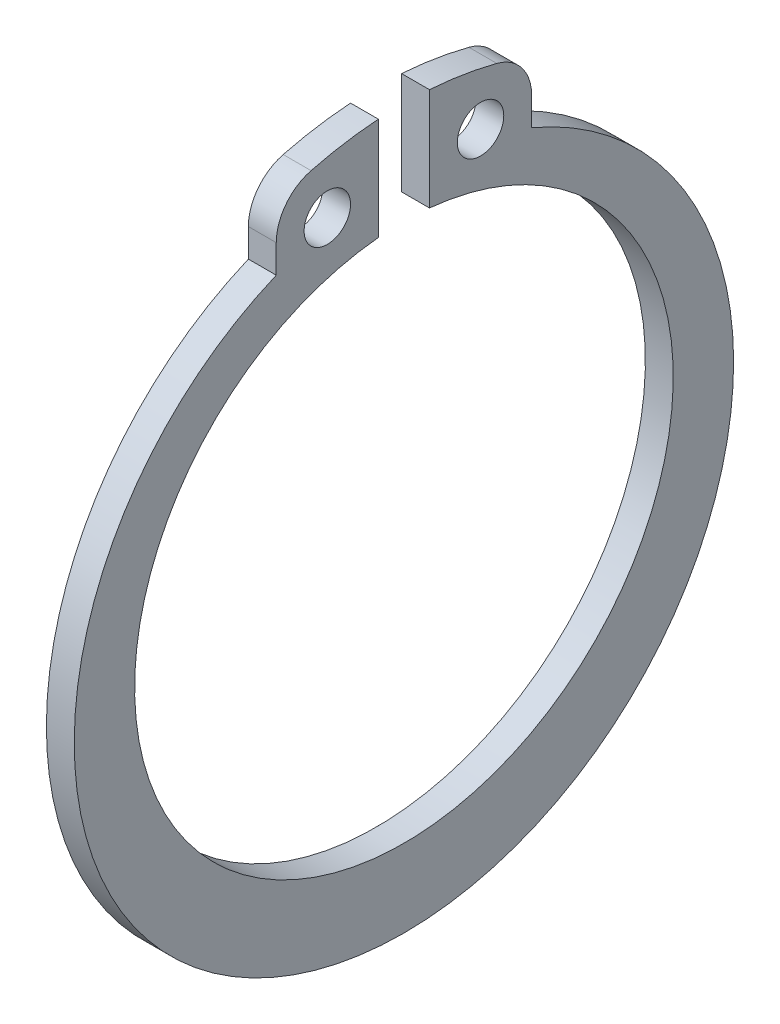
ISO-10303-21;
HEADER;
FILE_DESCRIPTION(('STEP AP214'),'2;1');
FILE_NAME('part.step','',(''),(''),'','','');
FILE_SCHEMA(('AUTOMOTIVE_DESIGN { 1 0 10303 214 1 1 1 1 }'));
ENDSEC;
DATA;
#1=APPLICATION_CONTEXT('core data for automotive mechanical design processes');
#2=APPLICATION_PROTOCOL_DEFINITION('international standard','automotive_design',2000,#1);
#3=PRODUCT_CONTEXT('',#1,'mechanical');
#4=PRODUCT('Part','Part','',(#3));
#5=PRODUCT_RELATED_PRODUCT_CATEGORY('part','',(#4));
#6=PRODUCT_DEFINITION_FORMATION('','',#4);
#7=PRODUCT_DEFINITION_CONTEXT('part definition',#1,'design');
#8=PRODUCT_DEFINITION('design','',#6,#7);
#9=PRODUCT_DEFINITION_SHAPE('','',#8);
#10=(LENGTH_UNIT() NAMED_UNIT(*) SI_UNIT(.MILLI.,.METRE.));
#11=(NAMED_UNIT(*) PLANE_ANGLE_UNIT() SI_UNIT($,.RADIAN.));
#12=(NAMED_UNIT(*) SI_UNIT($,.STERADIAN.) SOLID_ANGLE_UNIT());
#13=UNCERTAINTY_MEASURE_WITH_UNIT(LENGTH_MEASURE(1.E-05),#10,'distance_accuracy_value','');
#14=(GEOMETRIC_REPRESENTATION_CONTEXT(3) GLOBAL_UNCERTAINTY_ASSIGNED_CONTEXT((#13)) GLOBAL_UNIT_ASSIGNED_CONTEXT((#10,
#11,#12)) REPRESENTATION_CONTEXT('',''));
#15=CARTESIAN_POINT('',(0.,0.,0.));
#16=DIRECTION('',(0.,0.,1.));
#17=DIRECTION('',(1.,0.,0.));
#18=AXIS2_PLACEMENT_3D('',#15,#16,#17);
#19=CARTESIAN_POINT('',(0.99,8.34638827549408,2.275));
#20=DIRECTION('',(-1.,0.,0.));
#21=DIRECTION('',(0.,0.,1.));
#22=AXIS2_PLACEMENT_3D('',#19,#20,#21);
#23=CYLINDRICAL_SURFACE('',#22,1.3);
#24=CARTESIAN_POINT('',(0.21,8.34638827549408,2.275));
#25=DIRECTION('',(1.,0.,0.));
#26=DIRECTION('',(0.,0.,-1.));
#27=AXIS2_PLACEMENT_3D('',#24,#25,#26);
#28=CIRCLE('',#27,1.3);
#29=CARTESIAN_POINT('',(0.21,9.60510786301148,2.6));
#30=VERTEX_POINT('',#29);
#31=CARTESIAN_POINT('',(0.21,8.34638827549408,3.575));
#32=VERTEX_POINT('',#31);
#33=EDGE_CURVE('E11',#30,#32,#28,.T.);
#34=ORIENTED_EDGE('',*,*,#33,.T.);
#35=DIRECTION('',(-1.,0.,0.));
#36=VECTOR('',#35,1.);
#37=CARTESIAN_POINT('',(0.99,8.34638827549408,3.575));
#38=LINE('',#37,#36);
#39=CARTESIAN_POINT('',(0.99,8.34638827549408,3.575));
#40=VERTEX_POINT('',#39);
#41=EDGE_CURVE('E53',#40,#32,#38,.T.);
#42=ORIENTED_EDGE('',*,*,#41,.F.);
#43=CARTESIAN_POINT('',(0.99,8.34638827549408,2.275));
#44=DIRECTION('',(1.,0.,0.));
#45=DIRECTION('',(0.,0.,-1.));
#46=AXIS2_PLACEMENT_3D('',#43,#44,#45);
#47=CIRCLE('',#46,1.3);
#48=CARTESIAN_POINT('',(0.99,9.60510786301148,2.6));
#49=VERTEX_POINT('',#48);
#50=EDGE_CURVE('E164',#49,#40,#47,.T.);
#51=ORIENTED_EDGE('',*,*,#50,.F.);
#52=DIRECTION('',(-1.,0.,0.));
#53=VECTOR('',#52,1.);
#54=CARTESIAN_POINT('',(0.99,9.60510786301148,2.6));
#55=LINE('',#54,#53);
#56=EDGE_CURVE('E44',#49,#30,#55,.T.);
#57=ORIENTED_EDGE('',*,*,#56,.T.);
#58=EDGE_LOOP('',(#34,#42,#51,#57));
#59=FACE_BOUND('',#58,.T.);
#60=ADVANCED_FACE('F34',(#59),#23,.T.);
#61=CARTESIAN_POINT('',(0.99,-0.952148837127789,0.));
#62=DIRECTION('',(1.,0.,0.));
#63=DIRECTION('',(0.,0.,-1.));
#64=AXIS2_PLACEMENT_3D('',#61,#62,#63);
#65=PLANE('',#64);
#66=CARTESIAN_POINT('',(0.99,8.23777563582654,2.145));
#67=DIRECTION('',(1.,0.,0.));
#68=DIRECTION('',(0.,0.,-1.));
#69=AXIS2_PLACEMENT_3D('',#66,#67,#68);
#70=CIRCLE('',#69,0.65);
#71=CARTESIAN_POINT('',(0.99,8.23777563582654,1.495));
#72=VERTEX_POINT('',#71);
#73=EDGE_CURVE('E194',#72,#72,#70,.T.);
#74=ORIENTED_EDGE('',*,*,#73,.F.);
#75=EDGE_LOOP('',(#74));
#76=FACE_BOUND('',#75,.T.);
#77=CARTESIAN_POINT('',(0.99,8.23777563582654,-2.145));
#78=DIRECTION('',(1.,0.,0.));
#79=DIRECTION('',(0.,0.,-1.));
#80=AXIS2_PLACEMENT_3D('',#77,#78,#79);
#81=CIRCLE('',#80,0.65);
#82=CARTESIAN_POINT('',(0.99,8.23777563582654,-2.795));
#83=VERTEX_POINT('',#82);
#84=EDGE_CURVE('E65',#83,#83,#81,.T.);
#85=ORIENTED_EDGE('',*,*,#84,.F.);
#86=EDGE_LOOP('',(#85));
#87=FACE_BOUND('',#86,.T.);
#88=DIRECTION('',(0.,-1.,0.));
#89=VECTOR('',#88,1.);
#90=CARTESIAN_POINT('',(0.99,8.34638827549408,3.575));
#91=LINE('',#90,#89);
#92=CARTESIAN_POINT('',(0.99,7.55739139722095,3.575));
#93=VERTEX_POINT('',#92);
#94=EDGE_CURVE('E155',#40,#93,#91,.T.);
#95=ORIENTED_EDGE('',*,*,#94,.T.);
#96=CARTESIAN_POINT('',(0.99,-0.952148837127789,0.));
#97=DIRECTION('',(1.,0.,0.));
#98=DIRECTION('',(0.,0.,-1.));
#99=AXIS2_PLACEMENT_3D('',#96,#97,#98);
#100=CIRCLE('',#99,9.23);
#101=CARTESIAN_POINT('',(0.99,7.55739139722095,-3.575));
#102=VERTEX_POINT('',#101);
#103=EDGE_CURVE('E76',#93,#102,#100,.T.);
#104=ORIENTED_EDGE('',*,*,#103,.T.);
#105=DIRECTION('',(0.,1.,0.));
#106=VECTOR('',#105,1.);
#107=CARTESIAN_POINT('',(0.99,7.55739139722095,-3.575));
#108=LINE('',#107,#106);
#109=CARTESIAN_POINT('',(0.99,8.34638827549408,-3.575));
#110=VERTEX_POINT('',#109);
#111=EDGE_CURVE('E133',#102,#110,#108,.T.);
#112=ORIENTED_EDGE('',*,*,#111,.T.);
#113=CARTESIAN_POINT('',(0.99,8.34638827549408,-2.275));
#114=DIRECTION('',(1.,0.,0.));
#115=DIRECTION('',(0.,0.,-1.));
#116=AXIS2_PLACEMENT_3D('',#113,#114,#115);
#117=CIRCLE('',#116,1.3);
#118=CARTESIAN_POINT('',(0.99,9.60510784769696,-2.6000000593129));
#119=VERTEX_POINT('',#118);
#120=EDGE_CURVE('E123',#110,#119,#117,.T.);
#121=ORIENTED_EDGE('',*,*,#120,.T.);
#122=CARTESIAN_POINT('',(0.99,-0.464648837127586,0.));
#123=DIRECTION('',(1.,0.,0.));
#124=DIRECTION('',(0.,0.,-1.));
#125=AXIS2_PLACEMENT_3D('',#122,#123,#124);
#126=CIRCLE('',#125,10.3999999999998);
#127=CARTESIAN_POINT('',(0.99,9.91074392652218,-0.715000000000001));
#128=VERTEX_POINT('',#127);
#129=EDGE_CURVE('E134',#119,#128,#126,.T.);
#130=ORIENTED_EDGE('',*,*,#129,.T.);
#131=DIRECTION('',(0.,-1.,0.));
#132=VECTOR('',#131,1.);
#133=CARTESIAN_POINT('',(0.99,9.91074392652218,-0.715000000000001));
#134=LINE('',#133,#132);
#135=CARTESIAN_POINT('',(0.99,7.04137374477269,-0.715000000000001));
#136=VERTEX_POINT('',#135);
#137=EDGE_CURVE('E188',#128,#136,#134,.T.);
#138=ORIENTED_EDGE('',*,*,#137,.T.);
#139=CARTESIAN_POINT('',(0.99,-0.464648837127789,0.));
#140=DIRECTION('',(1.,0.,0.));
#141=DIRECTION('',(0.,0.,-1.));
#142=AXIS2_PLACEMENT_3D('',#139,#140,#141);
#143=CIRCLE('',#142,7.54);
#144=CARTESIAN_POINT('',(0.99,7.04137374477269,0.714999999999999));
#145=VERTEX_POINT('',#144);
#146=EDGE_CURVE('E157',#145,#136,#143,.T.);
#147=ORIENTED_EDGE('',*,*,#146,.F.);
#148=DIRECTION('',(0.,1.,0.));
#149=VECTOR('',#148,1.);
#150=CARTESIAN_POINT('',(0.99,7.04137374477269,0.714999999999999));
#151=LINE('',#150,#149);
#152=CARTESIAN_POINT('',(0.99,9.91074392652218,0.714999999999999));
#153=VERTEX_POINT('',#152);
#154=EDGE_CURVE('E153',#145,#153,#151,.T.);
#155=ORIENTED_EDGE('',*,*,#154,.T.);
#156=CARTESIAN_POINT('',(0.99,-0.464648837127489,0.));
#157=DIRECTION('',(1.,0.,0.));
#158=DIRECTION('',(0.,0.,-1.));
#159=AXIS2_PLACEMENT_3D('',#156,#157,#158);
#160=CIRCLE('',#159,10.3999999999997);
#161=EDGE_CURVE('E161',#153,#49,#160,.T.);
#162=ORIENTED_EDGE('',*,*,#161,.T.);
#163=ORIENTED_EDGE('',*,*,#50,.T.);
#164=EDGE_LOOP('',(#95,#104,#112,#121,#130,#138,#147,#155,#162,#163));
#165=FACE_BOUND('',#164,.T.);
#166=ADVANCED_FACE('F136',(#76,#87,#165),#65,.T.);
#167=CARTESIAN_POINT('',(0.99,8.23777563582654,2.145));
#168=DIRECTION('',(-1.,0.,0.));
#169=DIRECTION('',(0.,0.,1.));
#170=AXIS2_PLACEMENT_3D('',#167,#168,#169);
#171=CYLINDRICAL_SURFACE('',#170,0.65);
#172=ORIENTED_EDGE('',*,*,#73,.T.);
#173=EDGE_LOOP('',(#172));
#174=FACE_BOUND('',#173,.T.);
#175=CARTESIAN_POINT('',(0.21,8.23777563582654,2.145));
#176=DIRECTION('',(1.,0.,0.));
#177=DIRECTION('',(0.,0.,-1.));
#178=AXIS2_PLACEMENT_3D('',#175,#176,#177);
#179=CIRCLE('',#178,0.65);
#180=CARTESIAN_POINT('',(0.21,8.23777563582654,1.495));
#181=VERTEX_POINT('',#180);
#182=EDGE_CURVE('E189',#181,#181,#179,.T.);
#183=ORIENTED_EDGE('',*,*,#182,.F.);
#184=EDGE_LOOP('',(#183));
#185=FACE_BOUND('',#184,.T.);
#186=ADVANCED_FACE('F255',(#174,#185),#171,.F.);
#187=CARTESIAN_POINT('',(0.99,8.34638827549408,3.575));
#188=DIRECTION('',(0.,0.,-1.));
#189=DIRECTION('',(-1.,0.,0.));
#190=AXIS2_PLACEMENT_3D('',#187,#188,#189);
#191=PLANE('',#190);
#192=DIRECTION('',(0.,-1.,0.));
#193=VECTOR('',#192,1.);
#194=CARTESIAN_POINT('',(0.21,8.34638827549408,3.575));
#195=LINE('',#194,#193);
#196=CARTESIAN_POINT('',(0.21,7.55739139722095,3.575));
#197=VERTEX_POINT('',#196);
#198=EDGE_CURVE('E38',#32,#197,#195,.T.);
#199=ORIENTED_EDGE('',*,*,#198,.T.);
#200=DIRECTION('',(-1.,0.,0.));
#201=VECTOR('',#200,1.);
#202=CARTESIAN_POINT('',(0.99,7.55739139722095,3.575));
#203=LINE('',#202,#201);
#204=EDGE_CURVE('E168',#93,#197,#203,.T.);
#205=ORIENTED_EDGE('',*,*,#204,.F.);
#206=ORIENTED_EDGE('',*,*,#94,.F.);
#207=ORIENTED_EDGE('',*,*,#41,.T.);
#208=EDGE_LOOP('',(#199,#205,#206,#207));
#209=FACE_BOUND('',#208,.T.);
#210=ADVANCED_FACE('F218',(#209),#191,.F.);
#211=CARTESIAN_POINT('',(0.99,-0.952148837127789,0.));
#212=DIRECTION('',(-1.,0.,0.));
#213=DIRECTION('',(0.,0.,1.));
#214=AXIS2_PLACEMENT_3D('',#211,#212,#213);
#215=CYLINDRICAL_SURFACE('',#214,9.23);
#216=CARTESIAN_POINT('',(0.21,-0.952148837127789,0.));
#217=DIRECTION('',(1.,0.,0.));
#218=DIRECTION('',(0.,0.,-1.));
#219=AXIS2_PLACEMENT_3D('',#216,#217,#218);
#220=CIRCLE('',#219,9.23);
#221=CARTESIAN_POINT('',(0.21,7.55739139722095,-3.575));
#222=VERTEX_POINT('',#221);
#223=EDGE_CURVE('E165',#197,#222,#220,.T.);
#224=ORIENTED_EDGE('',*,*,#223,.T.);
#225=DIRECTION('',(-1.,0.,0.));
#226=VECTOR('',#225,1.);
#227=CARTESIAN_POINT('',(0.99,7.55739139722095,-3.575));
#228=LINE('',#227,#226);
#229=EDGE_CURVE('E147',#102,#222,#228,.T.);
#230=ORIENTED_EDGE('',*,*,#229,.F.);
#231=ORIENTED_EDGE('',*,*,#103,.F.);
#232=ORIENTED_EDGE('',*,*,#204,.T.);
#233=EDGE_LOOP('',(#224,#230,#231,#232));
#234=FACE_BOUND('',#233,.T.);
#235=ADVANCED_FACE('F215',(#234),#215,.T.);
#236=CARTESIAN_POINT('',(0.99,7.55739139722095,-3.575));
#237=DIRECTION('',(0.,0.,1.));
#238=DIRECTION('',(1.,0.,0.));
#239=AXIS2_PLACEMENT_3D('',#236,#237,#238);
#240=PLANE('',#239);
#241=DIRECTION('',(0.,1.,0.));
#242=VECTOR('',#241,1.);
#243=CARTESIAN_POINT('',(0.21,7.55739139722095,-3.575));
#244=LINE('',#243,#242);
#245=CARTESIAN_POINT('',(0.21,8.34638827549408,-3.575));
#246=VERTEX_POINT('',#245);
#247=EDGE_CURVE('E142',#222,#246,#244,.T.);
#248=ORIENTED_EDGE('',*,*,#247,.T.);
#249=DIRECTION('',(-1.,0.,0.));
#250=VECTOR('',#249,1.);
#251=CARTESIAN_POINT('',(0.99,8.34638827549408,-3.575));
#252=LINE('',#251,#250);
#253=EDGE_CURVE('E127',#110,#246,#252,.T.);
#254=ORIENTED_EDGE('',*,*,#253,.F.);
#255=ORIENTED_EDGE('',*,*,#111,.F.);
#256=ORIENTED_EDGE('',*,*,#229,.T.);
#257=EDGE_LOOP('',(#248,#254,#255,#256));
#258=FACE_BOUND('',#257,.T.);
#259=ADVANCED_FACE('F140',(#258),#240,.F.);
#260=CARTESIAN_POINT('',(0.99,8.34638827549408,-2.275));
#261=DIRECTION('',(-1.,0.,0.));
#262=DIRECTION('',(0.,0.,1.));
#263=AXIS2_PLACEMENT_3D('',#260,#261,#262);
#264=CYLINDRICAL_SURFACE('',#263,1.3);
#265=CARTESIAN_POINT('',(0.21,8.34638827549408,-2.275));
#266=DIRECTION('',(1.,0.,0.));
#267=DIRECTION('',(0.,0.,-1.));
#268=AXIS2_PLACEMENT_3D('',#265,#266,#267);
#269=CIRCLE('',#268,1.3);
#270=CARTESIAN_POINT('',(0.21,9.60510784769696,-2.6000000593129));
#271=VERTEX_POINT('',#270);
#272=EDGE_CURVE('E144',#246,#271,#269,.T.);
#273=ORIENTED_EDGE('',*,*,#272,.T.);
#274=DIRECTION('',(-1.,0.,0.));
#275=VECTOR('',#274,1.);
#276=CARTESIAN_POINT('',(0.99,9.60510784769696,-2.6000000593129));
#277=LINE('',#276,#275);
#278=EDGE_CURVE('E130',#119,#271,#277,.T.);
#279=ORIENTED_EDGE('',*,*,#278,.F.);
#280=ORIENTED_EDGE('',*,*,#120,.F.);
#281=ORIENTED_EDGE('',*,*,#253,.T.);
#282=EDGE_LOOP('',(#273,#279,#280,#281));
#283=FACE_BOUND('',#282,.T.);
#284=ADVANCED_FACE('F36',(#283),#264,.T.);
#285=CARTESIAN_POINT('',(0.99,-0.464648837127586,0.));
#286=DIRECTION('',(-1.,0.,0.));
#287=DIRECTION('',(0.,0.,1.));
#288=AXIS2_PLACEMENT_3D('',#285,#286,#287);
#289=CYLINDRICAL_SURFACE('',#288,10.3999999999998);
#290=CARTESIAN_POINT('',(0.21,-0.464648837127586,0.));
#291=DIRECTION('',(1.,0.,0.));
#292=DIRECTION('',(0.,0.,-1.));
#293=AXIS2_PLACEMENT_3D('',#290,#291,#292);
#294=CIRCLE('',#293,10.3999999999998);
#295=CARTESIAN_POINT('',(0.21,9.91074392652218,-0.715000000000001));
#296=VERTEX_POINT('',#295);
#297=EDGE_CURVE('E145',#271,#296,#294,.T.);
#298=ORIENTED_EDGE('',*,*,#297,.T.);
#299=DIRECTION('',(-1.,0.,0.));
#300=VECTOR('',#299,1.);
#301=CARTESIAN_POINT('',(0.99,9.91074392652218,-0.715000000000001));
#302=LINE('',#301,#300);
#303=EDGE_CURVE('E159',#128,#296,#302,.T.);
#304=ORIENTED_EDGE('',*,*,#303,.F.);
#305=ORIENTED_EDGE('',*,*,#129,.F.);
#306=ORIENTED_EDGE('',*,*,#278,.T.);
#307=EDGE_LOOP('',(#298,#304,#305,#306));
#308=FACE_BOUND('',#307,.T.);
#309=ADVANCED_FACE('F224',(#308),#289,.T.);
#310=CARTESIAN_POINT('',(0.99,9.91074392652218,-0.715000000000001));
#311=DIRECTION('',(0.,0.,-1.));
#312=DIRECTION('',(0.,1.,0.));
#313=AXIS2_PLACEMENT_3D('',#310,#311,#312);
#314=PLANE('',#313);
#315=DIRECTION('',(0.,-1.,0.));
#316=VECTOR('',#315,1.);
#317=CARTESIAN_POINT('',(0.21,9.91074392652218,-0.715000000000001));
#318=LINE('',#317,#316);
#319=CARTESIAN_POINT('',(0.21,7.04137374477269,-0.715000000000001));
#320=VERTEX_POINT('',#319);
#321=EDGE_CURVE('E169',#296,#320,#318,.T.);
#322=ORIENTED_EDGE('',*,*,#321,.T.);
#323=DIRECTION('',(-1.,0.,0.));
#324=VECTOR('',#323,1.);
#325=CARTESIAN_POINT('',(0.99,7.04137374477269,-0.715000000000001));
#326=LINE('',#325,#324);
#327=EDGE_CURVE('E160',#136,#320,#326,.T.);
#328=ORIENTED_EDGE('',*,*,#327,.F.);
#329=ORIENTED_EDGE('',*,*,#137,.F.);
#330=ORIENTED_EDGE('',*,*,#303,.T.);
#331=EDGE_LOOP('',(#322,#328,#329,#330));
#332=FACE_BOUND('',#331,.T.);
#333=ADVANCED_FACE('F241',(#332),#314,.F.);
#334=CARTESIAN_POINT('',(0.99,-0.464648837127789,0.));
#335=DIRECTION('',(-1.,0.,0.));
#336=DIRECTION('',(0.,0.,1.));
#337=AXIS2_PLACEMENT_3D('',#334,#335,#336);
#338=CYLINDRICAL_SURFACE('',#337,7.54);
#339=CARTESIAN_POINT('',(0.21,-0.464648837127789,0.));
#340=DIRECTION('',(1.,0.,0.));
#341=DIRECTION('',(0.,0.,-1.));
#342=AXIS2_PLACEMENT_3D('',#339,#340,#341);
#343=CIRCLE('',#342,7.54);
#344=CARTESIAN_POINT('',(0.21,7.04137374477269,0.714999999999999));
#345=VERTEX_POINT('',#344);
#346=EDGE_CURVE('E177',#345,#320,#343,.T.);
#347=ORIENTED_EDGE('',*,*,#346,.F.);
#348=DIRECTION('',(-1.,0.,0.));
#349=VECTOR('',#348,1.);
#350=CARTESIAN_POINT('',(0.99,7.04137374477269,0.714999999999999));
#351=LINE('',#350,#349);
#352=EDGE_CURVE('E175',#145,#345,#351,.T.);
#353=ORIENTED_EDGE('',*,*,#352,.F.);
#354=ORIENTED_EDGE('',*,*,#146,.T.);
#355=ORIENTED_EDGE('',*,*,#327,.T.);
#356=EDGE_LOOP('',(#347,#353,#354,#355));
#357=FACE_BOUND('',#356,.T.);
#358=ADVANCED_FACE('F240',(#357),#338,.F.);
#359=CARTESIAN_POINT('',(0.99,7.04137374477269,0.714999999999999));
#360=DIRECTION('',(0.,0.,1.));
#361=DIRECTION('',(0.,-1.,0.));
#362=AXIS2_PLACEMENT_3D('',#359,#360,#361);
#363=PLANE('',#362);
#364=DIRECTION('',(0.,1.,0.));
#365=VECTOR('',#364,1.);
#366=CARTESIAN_POINT('',(0.21,7.04137374477269,0.714999999999999));
#367=LINE('',#366,#365);
#368=CARTESIAN_POINT('',(0.21,9.91074392652218,0.714999999999999));
#369=VERTEX_POINT('',#368);
#370=EDGE_CURVE('E182',#345,#369,#367,.T.);
#371=ORIENTED_EDGE('',*,*,#370,.T.);
#372=DIRECTION('',(-1.,0.,0.));
#373=VECTOR('',#372,1.);
#374=CARTESIAN_POINT('',(0.99,9.91074392652218,0.714999999999999));
#375=LINE('',#374,#373);
#376=EDGE_CURVE('E176',#153,#369,#375,.T.);
#377=ORIENTED_EDGE('',*,*,#376,.F.);
#378=ORIENTED_EDGE('',*,*,#154,.F.);
#379=ORIENTED_EDGE('',*,*,#352,.T.);
#380=EDGE_LOOP('',(#371,#377,#378,#379));
#381=FACE_BOUND('',#380,.T.);
#382=ADVANCED_FACE('F236',(#381),#363,.F.);
#383=CARTESIAN_POINT('',(0.99,-0.464648837127489,0.));
#384=DIRECTION('',(-1.,0.,0.));
#385=DIRECTION('',(0.,0.,1.));
#386=AXIS2_PLACEMENT_3D('',#383,#384,#385);
#387=CYLINDRICAL_SURFACE('',#386,10.3999999999997);
#388=CARTESIAN_POINT('',(0.21,-0.464648837127489,0.));
#389=DIRECTION('',(1.,0.,0.));
#390=DIRECTION('',(0.,0.,-1.));
#391=AXIS2_PLACEMENT_3D('',#388,#389,#390);
#392=CIRCLE('',#391,10.3999999999997);
#393=EDGE_CURVE('E172',#369,#30,#392,.T.);
#394=ORIENTED_EDGE('',*,*,#393,.T.);
#395=ORIENTED_EDGE('',*,*,#56,.F.);
#396=ORIENTED_EDGE('',*,*,#161,.F.);
#397=ORIENTED_EDGE('',*,*,#376,.T.);
#398=EDGE_LOOP('',(#394,#395,#396,#397));
#399=FACE_BOUND('',#398,.T.);
#400=ADVANCED_FACE('F229',(#399),#387,.T.);
#401=CARTESIAN_POINT('',(0.99,8.23777563582654,-2.145));
#402=DIRECTION('',(-1.,0.,0.));
#403=DIRECTION('',(0.,0.,1.));
#404=AXIS2_PLACEMENT_3D('',#401,#402,#403);
#405=CYLINDRICAL_SURFACE('',#404,0.65);
#406=ORIENTED_EDGE('',*,*,#84,.T.);
#407=EDGE_LOOP('',(#406));
#408=FACE_BOUND('',#407,.T.);
#409=CARTESIAN_POINT('',(0.21,8.23777563582654,-2.145));
#410=DIRECTION('',(1.,0.,0.));
#411=DIRECTION('',(0.,0.,-1.));
#412=AXIS2_PLACEMENT_3D('',#409,#410,#411);
#413=CIRCLE('',#412,0.65);
#414=CARTESIAN_POINT('',(0.21,8.23777563582654,-2.795));
#415=VERTEX_POINT('',#414);
#416=EDGE_CURVE('E180',#415,#415,#413,.T.);
#417=ORIENTED_EDGE('',*,*,#416,.F.);
#418=EDGE_LOOP('',(#417));
#419=FACE_BOUND('',#418,.T.);
#420=ADVANCED_FACE('F268',(#408,#419),#405,.F.);
#421=CARTESIAN_POINT('',(0.21,-0.952148837127789,0.));
#422=DIRECTION('',(1.,0.,0.));
#423=DIRECTION('',(0.,0.,-1.));
#424=AXIS2_PLACEMENT_3D('',#421,#422,#423);
#425=PLANE('',#424);
#426=ORIENTED_EDGE('',*,*,#182,.T.);
#427=EDGE_LOOP('',(#426));
#428=FACE_BOUND('',#427,.T.);
#429=ORIENTED_EDGE('',*,*,#416,.T.);
#430=EDGE_LOOP('',(#429));
#431=FACE_BOUND('',#430,.T.);
#432=ORIENTED_EDGE('',*,*,#198,.F.);
#433=ORIENTED_EDGE('',*,*,#33,.F.);
#434=ORIENTED_EDGE('',*,*,#393,.F.);
#435=ORIENTED_EDGE('',*,*,#370,.F.);
#436=ORIENTED_EDGE('',*,*,#346,.T.);
#437=ORIENTED_EDGE('',*,*,#321,.F.);
#438=ORIENTED_EDGE('',*,*,#297,.F.);
#439=ORIENTED_EDGE('',*,*,#272,.F.);
#440=ORIENTED_EDGE('',*,*,#247,.F.);
#441=ORIENTED_EDGE('',*,*,#223,.F.);
#442=EDGE_LOOP('',(#432,#433,#434,#435,#436,#437,#438,#439,#440,#441));
#443=FACE_BOUND('',#442,.T.);
#444=ADVANCED_FACE('F221',(#428,#431,#443),#425,.F.);
#445=CLOSED_SHELL('',(#60,#166,#186,#210,#235,#259,#284,#309,#333,#358,#382,#400,#420,#444));
#446=MANIFOLD_SOLID_BREP('B2',#445);
#447=ADVANCED_BREP_SHAPE_REPRESENTATION('',(#18,#446),#14);
#448=SHAPE_DEFINITION_REPRESENTATION(#9,#447);
ENDSEC;
END-ISO-10303-21;
